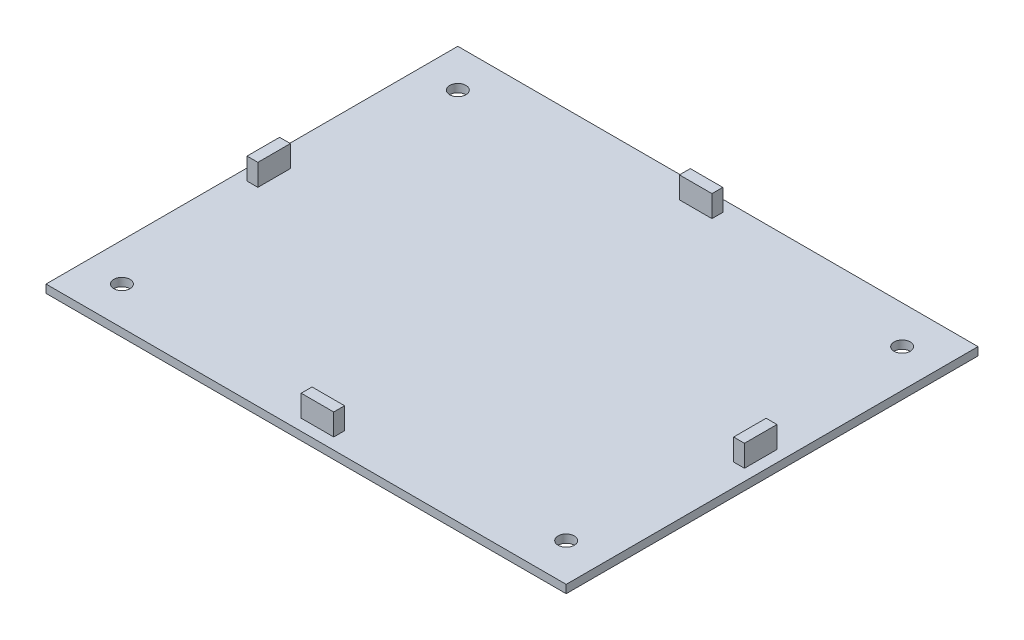
ISO-10303-21;
HEADER;
FILE_DESCRIPTION(('STEP AP214'),'2;1');
FILE_NAME('part.step','',(''),(''),'','','');
FILE_SCHEMA(('AUTOMOTIVE_DESIGN { 1 0 10303 214 1 1 1 1 }'));
ENDSEC;
DATA;
#1=APPLICATION_CONTEXT('core data for automotive mechanical design processes');
#2=APPLICATION_PROTOCOL_DEFINITION('international standard','automotive_design',2000,#1);
#3=PRODUCT_CONTEXT('',#1,'mechanical');
#4=PRODUCT('Part','Part','',(#3));
#5=PRODUCT_RELATED_PRODUCT_CATEGORY('part','',(#4));
#6=PRODUCT_DEFINITION_FORMATION('','',#4);
#7=PRODUCT_DEFINITION_CONTEXT('part definition',#1,'design');
#8=PRODUCT_DEFINITION('design','',#6,#7);
#9=PRODUCT_DEFINITION_SHAPE('','',#8);
#10=(LENGTH_UNIT() NAMED_UNIT(*) SI_UNIT(.MILLI.,.METRE.));
#11=(NAMED_UNIT(*) PLANE_ANGLE_UNIT() SI_UNIT($,.RADIAN.));
#12=(NAMED_UNIT(*) SI_UNIT($,.STERADIAN.) SOLID_ANGLE_UNIT());
#13=UNCERTAINTY_MEASURE_WITH_UNIT(LENGTH_MEASURE(1.E-05),#10,'distance_accuracy_value','');
#14=(GEOMETRIC_REPRESENTATION_CONTEXT(3) GLOBAL_UNCERTAINTY_ASSIGNED_CONTEXT((#13)) GLOBAL_UNIT_ASSIGNED_CONTEXT((#10,
#11,#12)) REPRESENTATION_CONTEXT('',''));
#15=CARTESIAN_POINT('',(0.,0.,0.));
#16=DIRECTION('',(0.,0.,1.));
#17=DIRECTION('',(1.,0.,0.));
#18=AXIS2_PLACEMENT_3D('',#15,#16,#17);
#19=CARTESIAN_POINT('',(0.,1.5,0.));
#20=DIRECTION('',(0.,1.,0.));
#21=DIRECTION('',(0.,0.,1.));
#22=AXIS2_PLACEMENT_3D('',#19,#20,#21);
#23=PLANE('',#22);
#24=CARTESIAN_POINT('',(41.,1.5,31.));
#25=DIRECTION('',(0.,-1.,0.));
#26=DIRECTION('',(0.,0.,1.));
#27=AXIS2_PLACEMENT_3D('',#24,#25,#26);
#28=CIRCLE('',#27,1.5);
#29=CARTESIAN_POINT('',(41.,1.5,32.5));
#30=VERTEX_POINT('',#29);
#31=EDGE_CURVE('E618',#30,#30,#28,.T.);
#32=ORIENTED_EDGE('',*,*,#31,.T.);
#33=EDGE_LOOP('',(#32));
#34=FACE_BOUND('',#33,.T.);
#35=CARTESIAN_POINT('',(41.,1.5,-31.));
#36=DIRECTION('',(0.,1.,0.));
#37=DIRECTION('',(0.,0.,-1.));
#38=AXIS2_PLACEMENT_3D('',#35,#36,#37);
#39=CIRCLE('',#38,1.5);
#40=CARTESIAN_POINT('',(41.,1.5,-32.5));
#41=VERTEX_POINT('',#40);
#42=EDGE_CURVE('E623',#41,#41,#39,.T.);
#43=ORIENTED_EDGE('',*,*,#42,.F.);
#44=EDGE_LOOP('',(#43));
#45=FACE_BOUND('',#44,.T.);
#46=CARTESIAN_POINT('',(-41.,1.5,-31.));
#47=DIRECTION('',(0.,-1.,0.));
#48=DIRECTION('',(0.,0.,-1.));
#49=AXIS2_PLACEMENT_3D('',#46,#47,#48);
#50=CIRCLE('',#49,1.5);
#51=CARTESIAN_POINT('',(-41.,1.5,-32.5));
#52=VERTEX_POINT('',#51);
#53=EDGE_CURVE('E632',#52,#52,#50,.T.);
#54=ORIENTED_EDGE('',*,*,#53,.T.);
#55=EDGE_LOOP('',(#54));
#56=FACE_BOUND('',#55,.T.);
#57=CARTESIAN_POINT('',(-41.,1.5,31.));
#58=DIRECTION('',(0.,1.,0.));
#59=DIRECTION('',(0.,0.,1.));
#60=AXIS2_PLACEMENT_3D('',#57,#58,#59);
#61=CIRCLE('',#60,1.5);
#62=CARTESIAN_POINT('',(-41.,1.5,32.5));
#63=VERTEX_POINT('',#62);
#64=EDGE_CURVE('E635',#63,#63,#61,.T.);
#65=ORIENTED_EDGE('',*,*,#64,.F.);
#66=EDGE_LOOP('',(#65));
#67=FACE_BOUND('',#66,.T.);
#68=DIRECTION('',(0.,0.,-1.));
#69=VECTOR('',#68,1.);
#70=CARTESIAN_POINT('',(48.,1.5,-38.));
#71=LINE('',#70,#69);
#72=CARTESIAN_POINT('',(48.,1.5,38.));
#73=VERTEX_POINT('',#72);
#74=CARTESIAN_POINT('',(48.,1.5,-38.));
#75=VERTEX_POINT('',#74);
#76=EDGE_CURVE('E290',#73,#75,#71,.T.);
#77=ORIENTED_EDGE('',*,*,#76,.T.);
#78=DIRECTION('',(-1.,0.,0.));
#79=VECTOR('',#78,1.);
#80=CARTESIAN_POINT('',(-48.,1.5,-38.));
#81=LINE('',#80,#79);
#82=CARTESIAN_POINT('',(-48.,1.5,-38.));
#83=VERTEX_POINT('',#82);
#84=EDGE_CURVE('E293',#75,#83,#81,.T.);
#85=ORIENTED_EDGE('',*,*,#84,.T.);
#86=DIRECTION('',(0.,0.,1.));
#87=VECTOR('',#86,1.);
#88=CARTESIAN_POINT('',(-48.,1.5,-38.));
#89=LINE('',#88,#87);
#90=CARTESIAN_POINT('',(-48.,1.5,38.));
#91=VERTEX_POINT('',#90);
#92=EDGE_CURVE('E296',#83,#91,#89,.T.);
#93=ORIENTED_EDGE('',*,*,#92,.T.);
#94=DIRECTION('',(1.,0.,0.));
#95=VECTOR('',#94,1.);
#96=CARTESIAN_POINT('',(-48.,1.5,38.));
#97=LINE('',#96,#95);
#98=EDGE_CURVE('E298',#91,#73,#97,.T.);
#99=ORIENTED_EDGE('',*,*,#98,.T.);
#100=EDGE_LOOP('',(#77,#85,#93,#99));
#101=FACE_BOUND('',#100,.T.);
#102=DIRECTION('',(-1.,0.,0.));
#103=VECTOR('',#102,1.);
#104=CARTESIAN_POINT('',(-3.,1.5,-35.9));
#105=LINE('',#104,#103);
#106=CARTESIAN_POINT('',(3.,1.5,-35.9));
#107=VERTEX_POINT('',#106);
#108=CARTESIAN_POINT('',(-3.,1.5,-35.9));
#109=VERTEX_POINT('',#108);
#110=EDGE_CURVE('E274',#107,#109,#105,.T.);
#111=ORIENTED_EDGE('',*,*,#110,.F.);
#112=DIRECTION('',(0.,0.,-1.));
#113=VECTOR('',#112,1.);
#114=CARTESIAN_POINT('',(3.,1.5,-35.9));
#115=LINE('',#114,#113);
#116=CARTESIAN_POINT('',(3.,1.5,-33.9));
#117=VERTEX_POINT('',#116);
#118=EDGE_CURVE('E260',#117,#107,#115,.T.);
#119=ORIENTED_EDGE('',*,*,#118,.F.);
#120=DIRECTION('',(1.,0.,0.));
#121=VECTOR('',#120,1.);
#122=CARTESIAN_POINT('',(-3.,1.5,-33.9));
#123=LINE('',#122,#121);
#124=CARTESIAN_POINT('',(-3.,1.5,-33.9));
#125=VERTEX_POINT('',#124);
#126=EDGE_CURVE('E265',#125,#117,#123,.T.);
#127=ORIENTED_EDGE('',*,*,#126,.F.);
#128=DIRECTION('',(0.,0.,1.));
#129=VECTOR('',#128,1.);
#130=CARTESIAN_POINT('',(-3.,1.5,-35.9));
#131=LINE('',#130,#129);
#132=EDGE_CURVE('E276',#109,#125,#131,.T.);
#133=ORIENTED_EDGE('',*,*,#132,.F.);
#134=EDGE_LOOP('',(#111,#119,#127,#133));
#135=FACE_BOUND('',#134,.T.);
#136=DIRECTION('',(-1.,0.,0.));
#137=VECTOR('',#136,1.);
#138=CARTESIAN_POINT('',(-45.9,1.5,-2.99999999999999));
#139=LINE('',#138,#137);
#140=CARTESIAN_POINT('',(-43.9,1.5,-2.99999999999999));
#141=VERTEX_POINT('',#140);
#142=CARTESIAN_POINT('',(-45.9,1.5,-2.99999999999999));
#143=VERTEX_POINT('',#142);
#144=EDGE_CURVE('E245',#141,#143,#139,.T.);
#145=ORIENTED_EDGE('',*,*,#144,.F.);
#146=DIRECTION('',(0.,0.,-1.));
#147=VECTOR('',#146,1.);
#148=CARTESIAN_POINT('',(-43.9,1.5,-2.99999999999999));
#149=LINE('',#148,#147);
#150=CARTESIAN_POINT('',(-43.9,1.5,3.00000000000001));
#151=VERTEX_POINT('',#150);
#152=EDGE_CURVE('E231',#151,#141,#149,.T.);
#153=ORIENTED_EDGE('',*,*,#152,.F.);
#154=DIRECTION('',(1.,0.,0.));
#155=VECTOR('',#154,1.);
#156=CARTESIAN_POINT('',(-45.9,1.5,3.00000000000001));
#157=LINE('',#156,#155);
#158=CARTESIAN_POINT('',(-45.9,1.5,3.00000000000001));
#159=VERTEX_POINT('',#158);
#160=EDGE_CURVE('E236',#159,#151,#157,.T.);
#161=ORIENTED_EDGE('',*,*,#160,.F.);
#162=DIRECTION('',(0.,0.,1.));
#163=VECTOR('',#162,1.);
#164=CARTESIAN_POINT('',(-45.9,1.5,-2.99999999999999));
#165=LINE('',#164,#163);
#166=EDGE_CURVE('E247',#143,#159,#165,.T.);
#167=ORIENTED_EDGE('',*,*,#166,.F.);
#168=EDGE_LOOP('',(#145,#153,#161,#167));
#169=FACE_BOUND('',#168,.T.);
#170=DIRECTION('',(1.,0.,0.));
#171=VECTOR('',#170,1.);
#172=CARTESIAN_POINT('',(2.99999999999999,1.5,35.9));
#173=LINE('',#172,#171);
#174=CARTESIAN_POINT('',(-3.00000000000001,1.5,35.9));
#175=VERTEX_POINT('',#174);
#176=CARTESIAN_POINT('',(2.99999999999999,1.5,35.9));
#177=VERTEX_POINT('',#176);
#178=EDGE_CURVE('E203',#175,#177,#173,.T.);
#179=ORIENTED_EDGE('',*,*,#178,.F.);
#180=DIRECTION('',(0.,0.,1.));
#181=VECTOR('',#180,1.);
#182=CARTESIAN_POINT('',(-3.00000000000001,1.5,35.9));
#183=LINE('',#182,#181);
#184=CARTESIAN_POINT('',(-3.00000000000001,1.5,33.9));
#185=VERTEX_POINT('',#184);
#186=EDGE_CURVE('E200',#185,#175,#183,.T.);
#187=ORIENTED_EDGE('',*,*,#186,.F.);
#188=DIRECTION('',(-1.,0.,0.));
#189=VECTOR('',#188,1.);
#190=CARTESIAN_POINT('',(2.99999999999999,1.5,33.9));
#191=LINE('',#190,#189);
#192=CARTESIAN_POINT('',(2.99999999999999,1.5,33.9));
#193=VERTEX_POINT('',#192);
#194=EDGE_CURVE('E212',#193,#185,#191,.T.);
#195=ORIENTED_EDGE('',*,*,#194,.F.);
#196=DIRECTION('',(0.,0.,-1.));
#197=VECTOR('',#196,1.);
#198=CARTESIAN_POINT('',(2.99999999999999,1.5,35.9));
#199=LINE('',#198,#197);
#200=EDGE_CURVE('E220',#177,#193,#199,.T.);
#201=ORIENTED_EDGE('',*,*,#200,.F.);
#202=EDGE_LOOP('',(#179,#187,#195,#201));
#203=FACE_BOUND('',#202,.T.);
#204=DIRECTION('',(0.,0.,1.));
#205=VECTOR('',#204,1.);
#206=CARTESIAN_POINT('',(43.9,1.5,3.));
#207=LINE('',#206,#205);
#208=CARTESIAN_POINT('',(43.9,1.5,-3.));
#209=VERTEX_POINT('',#208);
#210=CARTESIAN_POINT('',(43.9,1.5,3.));
#211=VERTEX_POINT('',#210);
#212=EDGE_CURVE('E647',#209,#211,#207,.T.);
#213=ORIENTED_EDGE('',*,*,#212,.F.);
#214=DIRECTION('',(-1.,0.,0.));
#215=VECTOR('',#214,1.);
#216=CARTESIAN_POINT('',(45.9,1.5,-3.));
#217=LINE('',#216,#215);
#218=CARTESIAN_POINT('',(45.9,1.5,-3.));
#219=VERTEX_POINT('',#218);
#220=EDGE_CURVE('E198',#219,#209,#217,.T.);
#221=ORIENTED_EDGE('',*,*,#220,.F.);
#222=DIRECTION('',(0.,0.,-1.));
#223=VECTOR('',#222,1.);
#224=CARTESIAN_POINT('',(45.9,1.5,3.));
#225=LINE('',#224,#223);
#226=CARTESIAN_POINT('',(45.9,1.5,3.));
#227=VERTEX_POINT('',#226);
#228=EDGE_CURVE('E194',#227,#219,#225,.T.);
#229=ORIENTED_EDGE('',*,*,#228,.F.);
#230=DIRECTION('',(1.,0.,0.));
#231=VECTOR('',#230,1.);
#232=CARTESIAN_POINT('',(45.9,1.5,3.));
#233=LINE('',#232,#231);
#234=EDGE_CURVE('E649',#211,#227,#233,.T.);
#235=ORIENTED_EDGE('',*,*,#234,.F.);
#236=EDGE_LOOP('',(#213,#221,#229,#235));
#237=FACE_BOUND('',#236,.T.);
#238=ADVANCED_FACE('F37',(#34,#45,#56,#67,#101,#135,#169,#203,#237),#23,.T.);
#239=CARTESIAN_POINT('',(48.,1.5,-38.));
#240=DIRECTION('',(-1.,0.,0.));
#241=DIRECTION('',(0.,0.,1.));
#242=AXIS2_PLACEMENT_3D('',#239,#240,#241);
#243=PLANE('',#242);
#244=DIRECTION('',(0.,0.,-1.));
#245=VECTOR('',#244,1.);
#246=CARTESIAN_POINT('',(48.,0.,-38.));
#247=LINE('',#246,#245);
#248=CARTESIAN_POINT('',(48.,0.,38.));
#249=VERTEX_POINT('',#248);
#250=CARTESIAN_POINT('',(48.,0.,-38.));
#251=VERTEX_POINT('',#250);
#252=EDGE_CURVE('E289',#249,#251,#247,.T.);
#253=ORIENTED_EDGE('',*,*,#252,.T.);
#254=DIRECTION('',(0.,-1.,0.));
#255=VECTOR('',#254,1.);
#256=CARTESIAN_POINT('',(48.,1.5,-38.));
#257=LINE('',#256,#255);
#258=EDGE_CURVE('E11',#75,#251,#257,.T.);
#259=ORIENTED_EDGE('',*,*,#258,.F.);
#260=ORIENTED_EDGE('',*,*,#76,.F.);
#261=DIRECTION('',(0.,-1.,0.));
#262=VECTOR('',#261,1.);
#263=CARTESIAN_POINT('',(48.,1.5,38.));
#264=LINE('',#263,#262);
#265=EDGE_CURVE('E300',#73,#249,#264,.T.);
#266=ORIENTED_EDGE('',*,*,#265,.T.);
#267=EDGE_LOOP('',(#253,#259,#260,#266));
#268=FACE_BOUND('',#267,.T.);
#269=ADVANCED_FACE('F39',(#268),#243,.F.);
#270=CARTESIAN_POINT('',(-48.,1.5,-38.));
#271=DIRECTION('',(0.,0.,1.));
#272=DIRECTION('',(1.,0.,0.));
#273=AXIS2_PLACEMENT_3D('',#270,#271,#272);
#274=PLANE('',#273);
#275=DIRECTION('',(-1.,0.,0.));
#276=VECTOR('',#275,1.);
#277=CARTESIAN_POINT('',(-48.,0.,-38.));
#278=LINE('',#277,#276);
#279=CARTESIAN_POINT('',(-48.,0.,-38.));
#280=VERTEX_POINT('',#279);
#281=EDGE_CURVE('E303',#251,#280,#278,.T.);
#282=ORIENTED_EDGE('',*,*,#281,.T.);
#283=DIRECTION('',(0.,-1.,0.));
#284=VECTOR('',#283,1.);
#285=CARTESIAN_POINT('',(-48.,1.5,-38.));
#286=LINE('',#285,#284);
#287=EDGE_CURVE('E45',#83,#280,#286,.T.);
#288=ORIENTED_EDGE('',*,*,#287,.F.);
#289=ORIENTED_EDGE('',*,*,#84,.F.);
#290=ORIENTED_EDGE('',*,*,#258,.T.);
#291=EDGE_LOOP('',(#282,#288,#289,#290));
#292=FACE_BOUND('',#291,.T.);
#293=ADVANCED_FACE('F333',(#292),#274,.F.);
#294=CARTESIAN_POINT('',(-48.,1.5,-38.));
#295=DIRECTION('',(1.,0.,0.));
#296=DIRECTION('',(0.,0.,-1.));
#297=AXIS2_PLACEMENT_3D('',#294,#295,#296);
#298=PLANE('',#297);
#299=DIRECTION('',(0.,0.,1.));
#300=VECTOR('',#299,1.);
#301=CARTESIAN_POINT('',(-48.,0.,-38.));
#302=LINE('',#301,#300);
#303=CARTESIAN_POINT('',(-48.,0.,38.));
#304=VERTEX_POINT('',#303);
#305=EDGE_CURVE('E305',#280,#304,#302,.T.);
#306=ORIENTED_EDGE('',*,*,#305,.T.);
#307=DIRECTION('',(0.,-1.,0.));
#308=VECTOR('',#307,1.);
#309=CARTESIAN_POINT('',(-48.,1.5,38.));
#310=LINE('',#309,#308);
#311=EDGE_CURVE('E310',#91,#304,#310,.T.);
#312=ORIENTED_EDGE('',*,*,#311,.F.);
#313=ORIENTED_EDGE('',*,*,#92,.F.);
#314=ORIENTED_EDGE('',*,*,#287,.T.);
#315=EDGE_LOOP('',(#306,#312,#313,#314));
#316=FACE_BOUND('',#315,.T.);
#317=ADVANCED_FACE('F317',(#316),#298,.F.);
#318=CARTESIAN_POINT('',(-48.,1.5,38.));
#319=DIRECTION('',(0.,0.,-1.));
#320=DIRECTION('',(-1.,0.,0.));
#321=AXIS2_PLACEMENT_3D('',#318,#319,#320);
#322=PLANE('',#321);
#323=DIRECTION('',(1.,0.,0.));
#324=VECTOR('',#323,1.);
#325=CARTESIAN_POINT('',(-48.,0.,38.));
#326=LINE('',#325,#324);
#327=EDGE_CURVE('E294',#304,#249,#326,.T.);
#328=ORIENTED_EDGE('',*,*,#327,.T.);
#329=ORIENTED_EDGE('',*,*,#265,.F.);
#330=ORIENTED_EDGE('',*,*,#98,.F.);
#331=ORIENTED_EDGE('',*,*,#311,.T.);
#332=EDGE_LOOP('',(#328,#329,#330,#331));
#333=FACE_BOUND('',#332,.T.);
#334=ADVANCED_FACE('F326',(#333),#322,.F.);
#335=CARTESIAN_POINT('',(0.,0.,0.));
#336=DIRECTION('',(0.,1.,0.));
#337=DIRECTION('',(0.,0.,1.));
#338=AXIS2_PLACEMENT_3D('',#335,#336,#337);
#339=PLANE('',#338);
#340=CARTESIAN_POINT('',(41.,0.,31.));
#341=DIRECTION('',(0.,1.,0.));
#342=DIRECTION('',(0.,0.,1.));
#343=AXIS2_PLACEMENT_3D('',#340,#341,#342);
#344=CIRCLE('',#343,1.5);
#345=CARTESIAN_POINT('',(41.,0.,32.5));
#346=VERTEX_POINT('',#345);
#347=EDGE_CURVE('E621',#346,#346,#344,.T.);
#348=ORIENTED_EDGE('',*,*,#347,.T.);
#349=EDGE_LOOP('',(#348));
#350=FACE_BOUND('',#349,.T.);
#351=CARTESIAN_POINT('',(41.,0.,-31.));
#352=DIRECTION('',(0.,1.,0.));
#353=DIRECTION('',(0.,0.,1.));
#354=AXIS2_PLACEMENT_3D('',#351,#352,#353);
#355=CIRCLE('',#354,1.5);
#356=CARTESIAN_POINT('',(41.,0.,-29.5));
#357=VERTEX_POINT('',#356);
#358=EDGE_CURVE('E628',#357,#357,#355,.F.);
#359=ORIENTED_EDGE('',*,*,#358,.F.);
#360=EDGE_LOOP('',(#359));
#361=FACE_BOUND('',#360,.T.);
#362=CARTESIAN_POINT('',(-41.,0.,-31.));
#363=DIRECTION('',(0.,1.,0.));
#364=DIRECTION('',(0.,0.,1.));
#365=AXIS2_PLACEMENT_3D('',#362,#363,#364);
#366=CIRCLE('',#365,1.5);
#367=CARTESIAN_POINT('',(-41.,0.,-29.5));
#368=VERTEX_POINT('',#367);
#369=EDGE_CURVE('E631',#368,#368,#366,.T.);
#370=ORIENTED_EDGE('',*,*,#369,.T.);
#371=EDGE_LOOP('',(#370));
#372=FACE_BOUND('',#371,.T.);
#373=CARTESIAN_POINT('',(-41.,0.,31.));
#374=DIRECTION('',(0.,1.,0.));
#375=DIRECTION('',(0.,0.,1.));
#376=AXIS2_PLACEMENT_3D('',#373,#374,#375);
#377=CIRCLE('',#376,1.5);
#378=CARTESIAN_POINT('',(-41.,0.,32.5));
#379=VERTEX_POINT('',#378);
#380=EDGE_CURVE('E640',#379,#379,#377,.F.);
#381=ORIENTED_EDGE('',*,*,#380,.F.);
#382=EDGE_LOOP('',(#381));
#383=FACE_BOUND('',#382,.T.);
#384=ORIENTED_EDGE('',*,*,#252,.F.);
#385=ORIENTED_EDGE('',*,*,#327,.F.);
#386=ORIENTED_EDGE('',*,*,#305,.F.);
#387=ORIENTED_EDGE('',*,*,#281,.F.);
#388=EDGE_LOOP('',(#384,#385,#386,#387));
#389=FACE_BOUND('',#388,.T.);
#390=ADVANCED_FACE('F323',(#350,#361,#372,#383,#389),#339,.F.);
#391=CARTESIAN_POINT('',(3.,5.5,-35.9));
#392=DIRECTION('',(-1.,0.,0.));
#393=DIRECTION('',(0.,0.,1.));
#394=AXIS2_PLACEMENT_3D('',#391,#392,#393);
#395=PLANE('',#394);
#396=ORIENTED_EDGE('',*,*,#118,.T.);
#397=DIRECTION('',(0.,-1.,0.));
#398=VECTOR('',#397,1.);
#399=CARTESIAN_POINT('',(3.,5.5,-35.9));
#400=LINE('',#399,#398);
#401=CARTESIAN_POINT('',(3.,5.5,-35.9));
#402=VERTEX_POINT('',#401);
#403=EDGE_CURVE('E287',#402,#107,#400,.T.);
#404=ORIENTED_EDGE('',*,*,#403,.F.);
#405=DIRECTION('',(0.,0.,-1.));
#406=VECTOR('',#405,1.);
#407=CARTESIAN_POINT('',(3.,5.5,-35.9));
#408=LINE('',#407,#406);
#409=CARTESIAN_POINT('',(3.,5.5,-33.9));
#410=VERTEX_POINT('',#409);
#411=EDGE_CURVE('E261',#410,#402,#408,.T.);
#412=ORIENTED_EDGE('',*,*,#411,.F.);
#413=DIRECTION('',(0.,-1.,0.));
#414=VECTOR('',#413,1.);
#415=CARTESIAN_POINT('',(3.,5.5,-33.9));
#416=LINE('',#415,#414);
#417=EDGE_CURVE('E271',#410,#117,#416,.T.);
#418=ORIENTED_EDGE('',*,*,#417,.T.);
#419=EDGE_LOOP('',(#396,#404,#412,#418));
#420=FACE_BOUND('',#419,.T.);
#421=ADVANCED_FACE('F349',(#420),#395,.F.);
#422=CARTESIAN_POINT('',(-3.,5.5,-35.9));
#423=DIRECTION('',(0.,0.,1.));
#424=DIRECTION('',(1.,0.,0.));
#425=AXIS2_PLACEMENT_3D('',#422,#423,#424);
#426=PLANE('',#425);
#427=ORIENTED_EDGE('',*,*,#110,.T.);
#428=DIRECTION('',(0.,-1.,0.));
#429=VECTOR('',#428,1.);
#430=CARTESIAN_POINT('',(-3.,5.5,-35.9));
#431=LINE('',#430,#429);
#432=CARTESIAN_POINT('',(-3.,5.5,-35.9));
#433=VERTEX_POINT('',#432);
#434=EDGE_CURVE('E284',#433,#109,#431,.T.);
#435=ORIENTED_EDGE('',*,*,#434,.F.);
#436=DIRECTION('',(-1.,0.,0.));
#437=VECTOR('',#436,1.);
#438=CARTESIAN_POINT('',(-3.,5.5,-35.9));
#439=LINE('',#438,#437);
#440=EDGE_CURVE('E264',#402,#433,#439,.T.);
#441=ORIENTED_EDGE('',*,*,#440,.F.);
#442=ORIENTED_EDGE('',*,*,#403,.T.);
#443=EDGE_LOOP('',(#427,#435,#441,#442));
#444=FACE_BOUND('',#443,.T.);
#445=ADVANCED_FACE('F370',(#444),#426,.F.);
#446=CARTESIAN_POINT('',(-3.,5.5,-35.9));
#447=DIRECTION('',(1.,0.,0.));
#448=DIRECTION('',(0.,0.,-1.));
#449=AXIS2_PLACEMENT_3D('',#446,#447,#448);
#450=PLANE('',#449);
#451=ORIENTED_EDGE('',*,*,#132,.T.);
#452=DIRECTION('',(0.,-1.,0.));
#453=VECTOR('',#452,1.);
#454=CARTESIAN_POINT('',(-3.,5.5,-33.9));
#455=LINE('',#454,#453);
#456=CARTESIAN_POINT('',(-3.,5.5,-33.9));
#457=VERTEX_POINT('',#456);
#458=EDGE_CURVE('E282',#457,#125,#455,.T.);
#459=ORIENTED_EDGE('',*,*,#458,.F.);
#460=DIRECTION('',(0.,0.,1.));
#461=VECTOR('',#460,1.);
#462=CARTESIAN_POINT('',(-3.,5.5,-35.9));
#463=LINE('',#462,#461);
#464=EDGE_CURVE('E267',#433,#457,#463,.T.);
#465=ORIENTED_EDGE('',*,*,#464,.F.);
#466=ORIENTED_EDGE('',*,*,#434,.T.);
#467=EDGE_LOOP('',(#451,#459,#465,#466));
#468=FACE_BOUND('',#467,.T.);
#469=ADVANCED_FACE('F377',(#468),#450,.F.);
#470=CARTESIAN_POINT('',(-3.,5.5,-33.9));
#471=DIRECTION('',(0.,0.,-1.));
#472=DIRECTION('',(-1.,0.,0.));
#473=AXIS2_PLACEMENT_3D('',#470,#471,#472);
#474=PLANE('',#473);
#475=ORIENTED_EDGE('',*,*,#126,.T.);
#476=ORIENTED_EDGE('',*,*,#417,.F.);
#477=DIRECTION('',(1.,0.,0.));
#478=VECTOR('',#477,1.);
#479=CARTESIAN_POINT('',(-3.,5.5,-33.9));
#480=LINE('',#479,#478);
#481=EDGE_CURVE('E269',#457,#410,#480,.T.);
#482=ORIENTED_EDGE('',*,*,#481,.F.);
#483=ORIENTED_EDGE('',*,*,#458,.T.);
#484=EDGE_LOOP('',(#475,#476,#482,#483));
#485=FACE_BOUND('',#484,.T.);
#486=ADVANCED_FACE('F384',(#485),#474,.F.);
#487=CARTESIAN_POINT('',(0.,5.5,0.));
#488=DIRECTION('',(0.,1.,0.));
#489=DIRECTION('',(0.,0.,1.));
#490=AXIS2_PLACEMENT_3D('',#487,#488,#489);
#491=PLANE('',#490);
#492=ORIENTED_EDGE('',*,*,#411,.T.);
#493=ORIENTED_EDGE('',*,*,#440,.T.);
#494=ORIENTED_EDGE('',*,*,#464,.T.);
#495=ORIENTED_EDGE('',*,*,#481,.T.);
#496=EDGE_LOOP('',(#492,#493,#494,#495));
#497=FACE_BOUND('',#496,.T.);
#498=ADVANCED_FACE('F392',(#497),#491,.T.);
#499=CARTESIAN_POINT('',(-43.9,5.5,-2.99999999999999));
#500=DIRECTION('',(-1.,0.,0.));
#501=DIRECTION('',(0.,0.,1.));
#502=AXIS2_PLACEMENT_3D('',#499,#500,#501);
#503=PLANE('',#502);
#504=ORIENTED_EDGE('',*,*,#152,.T.);
#505=DIRECTION('',(0.,-1.,0.));
#506=VECTOR('',#505,1.);
#507=CARTESIAN_POINT('',(-43.9,5.5,-2.99999999999999));
#508=LINE('',#507,#506);
#509=CARTESIAN_POINT('',(-43.9,5.5,-2.99999999999999));
#510=VERTEX_POINT('',#509);
#511=EDGE_CURVE('E258',#510,#141,#508,.T.);
#512=ORIENTED_EDGE('',*,*,#511,.F.);
#513=DIRECTION('',(0.,0.,-1.));
#514=VECTOR('',#513,1.);
#515=CARTESIAN_POINT('',(-43.9,5.5,-2.99999999999999));
#516=LINE('',#515,#514);
#517=CARTESIAN_POINT('',(-43.9,5.5,3.00000000000001));
#518=VERTEX_POINT('',#517);
#519=EDGE_CURVE('E232',#518,#510,#516,.T.);
#520=ORIENTED_EDGE('',*,*,#519,.F.);
#521=DIRECTION('',(0.,-1.,0.));
#522=VECTOR('',#521,1.);
#523=CARTESIAN_POINT('',(-43.9,5.5,3.00000000000001));
#524=LINE('',#523,#522);
#525=EDGE_CURVE('E242',#518,#151,#524,.T.);
#526=ORIENTED_EDGE('',*,*,#525,.T.);
#527=EDGE_LOOP('',(#504,#512,#520,#526));
#528=FACE_BOUND('',#527,.T.);
#529=ADVANCED_FACE('F400',(#528),#503,.F.);
#530=CARTESIAN_POINT('',(-45.9,5.5,-2.99999999999999));
#531=DIRECTION('',(0.,0.,1.));
#532=DIRECTION('',(1.,0.,0.));
#533=AXIS2_PLACEMENT_3D('',#530,#531,#532);
#534=PLANE('',#533);
#535=ORIENTED_EDGE('',*,*,#144,.T.);
#536=DIRECTION('',(0.,-1.,0.));
#537=VECTOR('',#536,1.);
#538=CARTESIAN_POINT('',(-45.9,5.5,-2.99999999999999));
#539=LINE('',#538,#537);
#540=CARTESIAN_POINT('',(-45.9,5.5,-2.99999999999999));
#541=VERTEX_POINT('',#540);
#542=EDGE_CURVE('E255',#541,#143,#539,.T.);
#543=ORIENTED_EDGE('',*,*,#542,.F.);
#544=DIRECTION('',(-1.,0.,0.));
#545=VECTOR('',#544,1.);
#546=CARTESIAN_POINT('',(-45.9,5.5,-2.99999999999999));
#547=LINE('',#546,#545);
#548=EDGE_CURVE('E235',#510,#541,#547,.T.);
#549=ORIENTED_EDGE('',*,*,#548,.F.);
#550=ORIENTED_EDGE('',*,*,#511,.T.);
#551=EDGE_LOOP('',(#535,#543,#549,#550));
#552=FACE_BOUND('',#551,.T.);
#553=ADVANCED_FACE('F408',(#552),#534,.F.);
#554=CARTESIAN_POINT('',(-45.9,5.5,-2.99999999999999));
#555=DIRECTION('',(1.,0.,0.));
#556=DIRECTION('',(0.,0.,-1.));
#557=AXIS2_PLACEMENT_3D('',#554,#555,#556);
#558=PLANE('',#557);
#559=ORIENTED_EDGE('',*,*,#166,.T.);
#560=DIRECTION('',(0.,-1.,0.));
#561=VECTOR('',#560,1.);
#562=CARTESIAN_POINT('',(-45.9,5.5,3.00000000000001));
#563=LINE('',#562,#561);
#564=CARTESIAN_POINT('',(-45.9,5.5,3.00000000000001));
#565=VERTEX_POINT('',#564);
#566=EDGE_CURVE('E253',#565,#159,#563,.T.);
#567=ORIENTED_EDGE('',*,*,#566,.F.);
#568=DIRECTION('',(0.,0.,1.));
#569=VECTOR('',#568,1.);
#570=CARTESIAN_POINT('',(-45.9,5.5,-2.99999999999999));
#571=LINE('',#570,#569);
#572=EDGE_CURVE('E238',#541,#565,#571,.T.);
#573=ORIENTED_EDGE('',*,*,#572,.F.);
#574=ORIENTED_EDGE('',*,*,#542,.T.);
#575=EDGE_LOOP('',(#559,#567,#573,#574));
#576=FACE_BOUND('',#575,.T.);
#577=ADVANCED_FACE('F416',(#576),#558,.F.);
#578=CARTESIAN_POINT('',(-45.9,5.5,3.00000000000001));
#579=DIRECTION('',(0.,0.,-1.));
#580=DIRECTION('',(-1.,0.,0.));
#581=AXIS2_PLACEMENT_3D('',#578,#579,#580);
#582=PLANE('',#581);
#583=ORIENTED_EDGE('',*,*,#160,.T.);
#584=ORIENTED_EDGE('',*,*,#525,.F.);
#585=DIRECTION('',(1.,0.,0.));
#586=VECTOR('',#585,1.);
#587=CARTESIAN_POINT('',(-45.9,5.5,3.00000000000001));
#588=LINE('',#587,#586);
#589=EDGE_CURVE('E240',#565,#518,#588,.T.);
#590=ORIENTED_EDGE('',*,*,#589,.F.);
#591=ORIENTED_EDGE('',*,*,#566,.T.);
#592=EDGE_LOOP('',(#583,#584,#590,#591));
#593=FACE_BOUND('',#592,.T.);
#594=ADVANCED_FACE('F424',(#593),#582,.F.);
#595=CARTESIAN_POINT('',(0.,5.5,0.));
#596=DIRECTION('',(0.,1.,0.));
#597=DIRECTION('',(0.,0.,1.));
#598=AXIS2_PLACEMENT_3D('',#595,#596,#597);
#599=PLANE('',#598);
#600=ORIENTED_EDGE('',*,*,#519,.T.);
#601=ORIENTED_EDGE('',*,*,#548,.T.);
#602=ORIENTED_EDGE('',*,*,#572,.T.);
#603=ORIENTED_EDGE('',*,*,#589,.T.);
#604=EDGE_LOOP('',(#600,#601,#602,#603));
#605=FACE_BOUND('',#604,.T.);
#606=ADVANCED_FACE('F432',(#605),#599,.T.);
#607=CARTESIAN_POINT('',(-3.00000000000001,5.5,35.9));
#608=DIRECTION('',(1.,0.,0.));
#609=DIRECTION('',(0.,0.,-1.));
#610=AXIS2_PLACEMENT_3D('',#607,#608,#609);
#611=PLANE('',#610);
#612=ORIENTED_EDGE('',*,*,#186,.T.);
#613=DIRECTION('',(0.,-1.,0.));
#614=VECTOR('',#613,1.);
#615=CARTESIAN_POINT('',(-3.00000000000001,5.5,35.9));
#616=LINE('',#615,#614);
#617=CARTESIAN_POINT('',(-3.00000000000001,5.5,35.9));
#618=VERTEX_POINT('',#617);
#619=EDGE_CURVE('E229',#618,#175,#616,.T.);
#620=ORIENTED_EDGE('',*,*,#619,.F.);
#621=DIRECTION('',(0.,0.,1.));
#622=VECTOR('',#621,1.);
#623=CARTESIAN_POINT('',(-3.00000000000001,5.5,35.9));
#624=LINE('',#623,#622);
#625=CARTESIAN_POINT('',(-3.00000000000001,5.5,33.9));
#626=VERTEX_POINT('',#625);
#627=EDGE_CURVE('E208',#626,#618,#624,.T.);
#628=ORIENTED_EDGE('',*,*,#627,.F.);
#629=DIRECTION('',(0.,-1.,0.));
#630=VECTOR('',#629,1.);
#631=CARTESIAN_POINT('',(-3.00000000000001,5.5,33.9));
#632=LINE('',#631,#630);
#633=EDGE_CURVE('E217',#626,#185,#632,.T.);
#634=ORIENTED_EDGE('',*,*,#633,.T.);
#635=EDGE_LOOP('',(#612,#620,#628,#634));
#636=FACE_BOUND('',#635,.T.);
#637=ADVANCED_FACE('F440',(#636),#611,.F.);
#638=CARTESIAN_POINT('',(2.99999999999999,5.5,35.9));
#639=DIRECTION('',(0.,0.,-1.));
#640=DIRECTION('',(-1.,0.,0.));
#641=AXIS2_PLACEMENT_3D('',#638,#639,#640);
#642=PLANE('',#641);
#643=ORIENTED_EDGE('',*,*,#178,.T.);
#644=DIRECTION('',(0.,-1.,0.));
#645=VECTOR('',#644,1.);
#646=CARTESIAN_POINT('',(2.99999999999999,5.5,35.9));
#647=LINE('',#646,#645);
#648=CARTESIAN_POINT('',(2.99999999999999,5.5,35.9));
#649=VERTEX_POINT('',#648);
#650=EDGE_CURVE('E226',#649,#177,#647,.T.);
#651=ORIENTED_EDGE('',*,*,#650,.F.);
#652=DIRECTION('',(1.,0.,0.));
#653=VECTOR('',#652,1.);
#654=CARTESIAN_POINT('',(2.99999999999999,5.5,35.9));
#655=LINE('',#654,#653);
#656=EDGE_CURVE('E211',#618,#649,#655,.T.);
#657=ORIENTED_EDGE('',*,*,#656,.F.);
#658=ORIENTED_EDGE('',*,*,#619,.T.);
#659=EDGE_LOOP('',(#643,#651,#657,#658));
#660=FACE_BOUND('',#659,.T.);
#661=ADVANCED_FACE('F448',(#660),#642,.F.);
#662=CARTESIAN_POINT('',(2.99999999999999,5.5,35.9));
#663=DIRECTION('',(-1.,0.,0.));
#664=DIRECTION('',(0.,0.,1.));
#665=AXIS2_PLACEMENT_3D('',#662,#663,#664);
#666=PLANE('',#665);
#667=ORIENTED_EDGE('',*,*,#200,.T.);
#668=DIRECTION('',(0.,-1.,0.));
#669=VECTOR('',#668,1.);
#670=CARTESIAN_POINT('',(2.99999999999999,5.5,33.9));
#671=LINE('',#670,#669);
#672=CARTESIAN_POINT('',(2.99999999999999,5.5,33.9));
#673=VERTEX_POINT('',#672);
#674=EDGE_CURVE('E60',#673,#193,#671,.T.);
#675=ORIENTED_EDGE('',*,*,#674,.F.);
#676=DIRECTION('',(0.,0.,-1.));
#677=VECTOR('',#676,1.);
#678=CARTESIAN_POINT('',(2.99999999999999,5.5,35.9));
#679=LINE('',#678,#677);
#680=EDGE_CURVE('E214',#649,#673,#679,.T.);
#681=ORIENTED_EDGE('',*,*,#680,.F.);
#682=ORIENTED_EDGE('',*,*,#650,.T.);
#683=EDGE_LOOP('',(#667,#675,#681,#682));
#684=FACE_BOUND('',#683,.T.);
#685=ADVANCED_FACE('F456',(#684),#666,.F.);
#686=CARTESIAN_POINT('',(2.99999999999999,5.5,33.9));
#687=DIRECTION('',(0.,0.,1.));
#688=DIRECTION('',(1.,0.,0.));
#689=AXIS2_PLACEMENT_3D('',#686,#687,#688);
#690=PLANE('',#689);
#691=ORIENTED_EDGE('',*,*,#194,.T.);
#692=ORIENTED_EDGE('',*,*,#633,.F.);
#693=DIRECTION('',(-1.,0.,0.));
#694=VECTOR('',#693,1.);
#695=CARTESIAN_POINT('',(2.99999999999999,5.5,33.9));
#696=LINE('',#695,#694);
#697=EDGE_CURVE('E216',#673,#626,#696,.T.);
#698=ORIENTED_EDGE('',*,*,#697,.F.);
#699=ORIENTED_EDGE('',*,*,#674,.T.);
#700=EDGE_LOOP('',(#691,#692,#698,#699));
#701=FACE_BOUND('',#700,.T.);
#702=ADVANCED_FACE('F464',(#701),#690,.F.);
#703=CARTESIAN_POINT('',(0.,5.5,0.));
#704=DIRECTION('',(0.,1.,0.));
#705=DIRECTION('',(0.,0.,1.));
#706=AXIS2_PLACEMENT_3D('',#703,#704,#705);
#707=PLANE('',#706);
#708=ORIENTED_EDGE('',*,*,#627,.T.);
#709=ORIENTED_EDGE('',*,*,#656,.T.);
#710=ORIENTED_EDGE('',*,*,#680,.T.);
#711=ORIENTED_EDGE('',*,*,#697,.T.);
#712=EDGE_LOOP('',(#708,#709,#710,#711));
#713=FACE_BOUND('',#712,.T.);
#714=ADVANCED_FACE('F472',(#713),#707,.T.);
#715=CARTESIAN_POINT('',(45.9,5.5,-3.));
#716=DIRECTION('',(0.,0.,1.));
#717=DIRECTION('',(1.,0.,0.));
#718=AXIS2_PLACEMENT_3D('',#715,#716,#717);
#719=PLANE('',#718);
#720=ORIENTED_EDGE('',*,*,#220,.T.);
#721=DIRECTION('',(0.,-1.,0.));
#722=VECTOR('',#721,1.);
#723=CARTESIAN_POINT('',(43.9,5.5,-3.));
#724=LINE('',#723,#722);
#725=CARTESIAN_POINT('',(43.9,5.5,-3.));
#726=VERTEX_POINT('',#725);
#727=EDGE_CURVE('E179',#726,#209,#724,.T.);
#728=ORIENTED_EDGE('',*,*,#727,.F.);
#729=DIRECTION('',(-1.,0.,0.));
#730=VECTOR('',#729,1.);
#731=CARTESIAN_POINT('',(45.9,5.5,-3.));
#732=LINE('',#731,#730);
#733=CARTESIAN_POINT('',(45.9,5.5,-3.));
#734=VERTEX_POINT('',#733);
#735=EDGE_CURVE('E186',#734,#726,#732,.T.);
#736=ORIENTED_EDGE('',*,*,#735,.F.);
#737=DIRECTION('',(0.,-1.,0.));
#738=VECTOR('',#737,1.);
#739=CARTESIAN_POINT('',(45.9,5.5,-3.));
#740=LINE('',#739,#738);
#741=EDGE_CURVE('E645',#734,#219,#740,.T.);
#742=ORIENTED_EDGE('',*,*,#741,.T.);
#743=EDGE_LOOP('',(#720,#728,#736,#742));
#744=FACE_BOUND('',#743,.T.);
#745=ADVANCED_FACE('F196',(#744),#719,.F.);
#746=CARTESIAN_POINT('',(43.9,5.5,3.));
#747=DIRECTION('',(1.,0.,0.));
#748=DIRECTION('',(0.,0.,-1.));
#749=AXIS2_PLACEMENT_3D('',#746,#747,#748);
#750=PLANE('',#749);
#751=ORIENTED_EDGE('',*,*,#212,.T.);
#752=DIRECTION('',(0.,-1.,0.));
#753=VECTOR('',#752,1.);
#754=CARTESIAN_POINT('',(43.9,5.5,3.));
#755=LINE('',#754,#753);
#756=CARTESIAN_POINT('',(43.9,5.5,3.));
#757=VERTEX_POINT('',#756);
#758=EDGE_CURVE('E182',#757,#211,#755,.T.);
#759=ORIENTED_EDGE('',*,*,#758,.F.);
#760=DIRECTION('',(0.,0.,1.));
#761=VECTOR('',#760,1.);
#762=CARTESIAN_POINT('',(43.9,5.5,3.));
#763=LINE('',#762,#761);
#764=EDGE_CURVE('E175',#726,#757,#763,.T.);
#765=ORIENTED_EDGE('',*,*,#764,.F.);
#766=ORIENTED_EDGE('',*,*,#727,.T.);
#767=EDGE_LOOP('',(#751,#759,#765,#766));
#768=FACE_BOUND('',#767,.T.);
#769=ADVANCED_FACE('F177',(#768),#750,.F.);
#770=CARTESIAN_POINT('',(45.9,5.5,3.));
#771=DIRECTION('',(0.,0.,-1.));
#772=DIRECTION('',(-1.,0.,0.));
#773=AXIS2_PLACEMENT_3D('',#770,#771,#772);
#774=PLANE('',#773);
#775=ORIENTED_EDGE('',*,*,#234,.T.);
#776=DIRECTION('',(0.,-1.,0.));
#777=VECTOR('',#776,1.);
#778=CARTESIAN_POINT('',(45.9,5.5,3.));
#779=LINE('',#778,#777);
#780=CARTESIAN_POINT('',(45.9,5.5,3.));
#781=VERTEX_POINT('',#780);
#782=EDGE_CURVE('E52',#781,#227,#779,.T.);
#783=ORIENTED_EDGE('',*,*,#782,.F.);
#784=DIRECTION('',(1.,0.,0.));
#785=VECTOR('',#784,1.);
#786=CARTESIAN_POINT('',(45.9,5.5,3.));
#787=LINE('',#786,#785);
#788=EDGE_CURVE('E185',#757,#781,#787,.T.);
#789=ORIENTED_EDGE('',*,*,#788,.F.);
#790=ORIENTED_EDGE('',*,*,#758,.T.);
#791=EDGE_LOOP('',(#775,#783,#789,#790));
#792=FACE_BOUND('',#791,.T.);
#793=ADVANCED_FACE('F492',(#792),#774,.F.);
#794=CARTESIAN_POINT('',(45.9,5.5,3.));
#795=DIRECTION('',(-1.,0.,0.));
#796=DIRECTION('',(0.,0.,1.));
#797=AXIS2_PLACEMENT_3D('',#794,#795,#796);
#798=PLANE('',#797);
#799=ORIENTED_EDGE('',*,*,#228,.T.);
#800=ORIENTED_EDGE('',*,*,#741,.F.);
#801=DIRECTION('',(0.,0.,-1.));
#802=VECTOR('',#801,1.);
#803=CARTESIAN_POINT('',(45.9,5.5,3.));
#804=LINE('',#803,#802);
#805=EDGE_CURVE('E190',#781,#734,#804,.T.);
#806=ORIENTED_EDGE('',*,*,#805,.F.);
#807=ORIENTED_EDGE('',*,*,#782,.T.);
#808=EDGE_LOOP('',(#799,#800,#806,#807));
#809=FACE_BOUND('',#808,.T.);
#810=ADVANCED_FACE('F499',(#809),#798,.F.);
#811=CARTESIAN_POINT('',(0.,5.5,0.));
#812=DIRECTION('',(0.,-1.,0.));
#813=DIRECTION('',(0.,0.,-1.));
#814=AXIS2_PLACEMENT_3D('',#811,#812,#813);
#815=PLANE('',#814);
#816=ORIENTED_EDGE('',*,*,#735,.T.);
#817=ORIENTED_EDGE('',*,*,#764,.T.);
#818=ORIENTED_EDGE('',*,*,#788,.T.);
#819=ORIENTED_EDGE('',*,*,#805,.T.);
#820=EDGE_LOOP('',(#816,#817,#818,#819));
#821=FACE_BOUND('',#820,.T.);
#822=ADVANCED_FACE('F189',(#821),#815,.F.);
#823=CARTESIAN_POINT('',(-41.,-0.000999999999999916,31.));
#824=DIRECTION('',(0.,1.,0.));
#825=DIRECTION('',(0.,0.,1.));
#826=AXIS2_PLACEMENT_3D('',#823,#824,#825);
#827=CYLINDRICAL_SURFACE('',#826,1.5);
#828=ORIENTED_EDGE('',*,*,#64,.T.);
#829=EDGE_LOOP('',(#828));
#830=FACE_BOUND('',#829,.T.);
#831=ORIENTED_EDGE('',*,*,#380,.T.);
#832=EDGE_LOOP('',(#831));
#833=FACE_BOUND('',#832,.T.);
#834=ADVANCED_FACE('F513',(#830,#833),#827,.F.);
#835=CARTESIAN_POINT('',(-41.,-0.000999999999999916,-31.));
#836=DIRECTION('',(0.,1.,0.));
#837=DIRECTION('',(0.,0.,1.));
#838=AXIS2_PLACEMENT_3D('',#835,#836,#837);
#839=CYLINDRICAL_SURFACE('',#838,1.5);
#840=ORIENTED_EDGE('',*,*,#53,.F.);
#841=EDGE_LOOP('',(#840));
#842=FACE_BOUND('',#841,.T.);
#843=ORIENTED_EDGE('',*,*,#369,.F.);
#844=EDGE_LOOP('',(#843));
#845=FACE_BOUND('',#844,.T.);
#846=ADVANCED_FACE('F520',(#842,#845),#839,.F.);
#847=CARTESIAN_POINT('',(41.,-0.000999999999999916,-31.));
#848=DIRECTION('',(0.,1.,0.));
#849=DIRECTION('',(0.,0.,1.));
#850=AXIS2_PLACEMENT_3D('',#847,#848,#849);
#851=CYLINDRICAL_SURFACE('',#850,1.5);
#852=ORIENTED_EDGE('',*,*,#42,.T.);
#853=EDGE_LOOP('',(#852));
#854=FACE_BOUND('',#853,.T.);
#855=ORIENTED_EDGE('',*,*,#358,.T.);
#856=EDGE_LOOP('',(#855));
#857=FACE_BOUND('',#856,.T.);
#858=ADVANCED_FACE('F528',(#854,#857),#851,.F.);
#859=CARTESIAN_POINT('',(41.,-0.000999999999999916,31.));
#860=DIRECTION('',(0.,1.,0.));
#861=DIRECTION('',(0.,0.,1.));
#862=AXIS2_PLACEMENT_3D('',#859,#860,#861);
#863=CYLINDRICAL_SURFACE('',#862,1.5);
#864=ORIENTED_EDGE('',*,*,#31,.F.);
#865=EDGE_LOOP('',(#864));
#866=FACE_BOUND('',#865,.T.);
#867=ORIENTED_EDGE('',*,*,#347,.F.);
#868=EDGE_LOOP('',(#867));
#869=FACE_BOUND('',#868,.T.);
#870=ADVANCED_FACE('F535',(#866,#869),#863,.F.);
#871=CLOSED_SHELL('',(#238,#269,#293,#317,#334,#390,#421,#445,#469,#486,#498,#529,#553,#577,
#594,#606,#637,#661,#685,#702,#714,#745,#769,#793,#810,#822,#834,#846,#858,#870));
#872=MANIFOLD_SOLID_BREP('B2',#871);
#873=ADVANCED_BREP_SHAPE_REPRESENTATION('',(#18,#872),#14);
#874=SHAPE_DEFINITION_REPRESENTATION(#9,#873);
ENDSEC;
END-ISO-10303-21;
